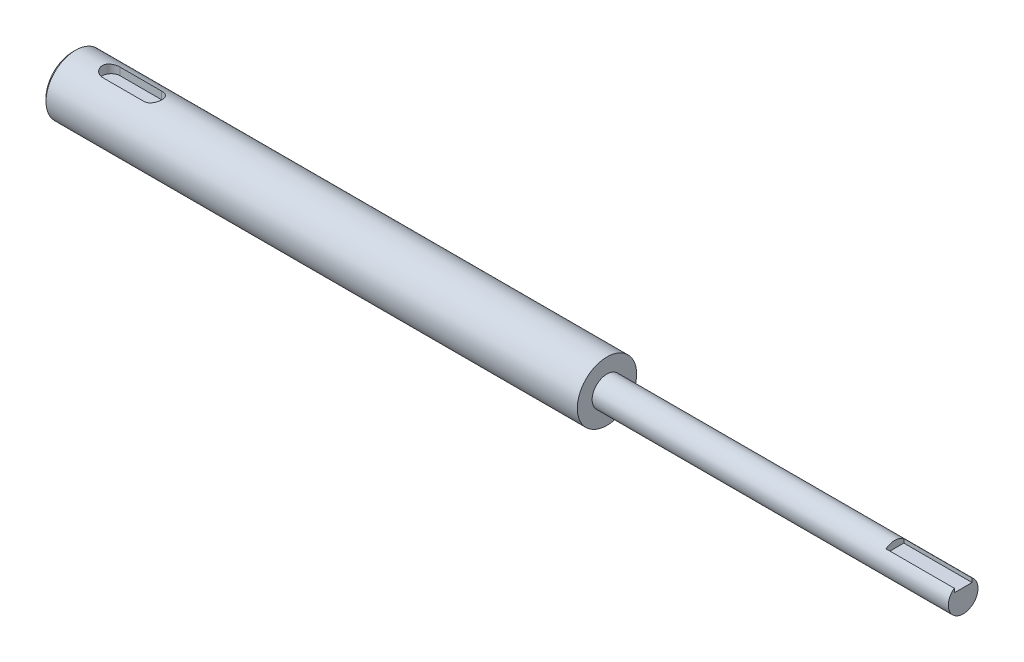
ISO-10303-21;
HEADER;
FILE_DESCRIPTION(('STEP AP214'),'2;1');
FILE_NAME('part.step','',(''),(''),'','','');
FILE_SCHEMA(('AUTOMOTIVE_DESIGN { 1 0 10303 214 1 1 1 1 }'));
ENDSEC;
DATA;
#1=APPLICATION_CONTEXT('core data for automotive mechanical design processes');
#2=APPLICATION_PROTOCOL_DEFINITION('international standard','automotive_design',2000,#1);
#3=PRODUCT_CONTEXT('',#1,'mechanical');
#4=PRODUCT('Part','Part','',(#3));
#5=PRODUCT_RELATED_PRODUCT_CATEGORY('part','',(#4));
#6=PRODUCT_DEFINITION_FORMATION('','',#4);
#7=PRODUCT_DEFINITION_CONTEXT('part definition',#1,'design');
#8=PRODUCT_DEFINITION('design','',#6,#7);
#9=PRODUCT_DEFINITION_SHAPE('','',#8);
#10=(LENGTH_UNIT() NAMED_UNIT(*) SI_UNIT(.MILLI.,.METRE.));
#11=(NAMED_UNIT(*) PLANE_ANGLE_UNIT() SI_UNIT($,.RADIAN.));
#12=(NAMED_UNIT(*) SI_UNIT($,.STERADIAN.) SOLID_ANGLE_UNIT());
#13=UNCERTAINTY_MEASURE_WITH_UNIT(LENGTH_MEASURE(1.E-05),#10,'distance_accuracy_value','');
#14=(GEOMETRIC_REPRESENTATION_CONTEXT(3) GLOBAL_UNCERTAINTY_ASSIGNED_CONTEXT((#13)) GLOBAL_UNIT_ASSIGNED_CONTEXT((#10,
#11,#12)) REPRESENTATION_CONTEXT('',''));
#15=CARTESIAN_POINT('',(0.,0.,0.));
#16=DIRECTION('',(0.,0.,1.));
#17=DIRECTION('',(1.,0.,0.));
#18=AXIS2_PLACEMENT_3D('',#15,#16,#17);
#19=CARTESIAN_POINT('',(150.,0.,0.));
#20=DIRECTION('',(-1.,0.,0.));
#21=DIRECTION('',(0.,0.,1.));
#22=AXIS2_PLACEMENT_3D('',#19,#20,#21);
#23=CYLINDRICAL_SURFACE('',#22,10.);
#24=DIRECTION('',(-1.,0.,0.));
#25=VECTOR('',#24,1.);
#26=CARTESIAN_POINT('',(150.,9.53939201416946,-3.));
#27=LINE('',#26,#25);
#28=CARTESIAN_POINT('',(13.,9.53939201416946,-3.));
#29=VERTEX_POINT('',#28);
#30=CARTESIAN_POINT('',(27.,9.53939201416946,-3.));
#31=VERTEX_POINT('',#30);
#32=EDGE_CURVE('E221',#29,#31,#27,.F.);
#33=ORIENTED_EDGE('',*,*,#32,.T.);
#34=CARTESIAN_POINT('',(27.,9.53939201416946,-3.));
#35=CARTESIAN_POINT('',(27.0823355208227,9.53938054248207,-3.00001027845728));
#36=CARTESIAN_POINT('',(27.1646644550632,9.54045772064378,-2.99661062684472));
#37=CARTESIAN_POINT('',(27.3286939527655,9.54470412105986,-2.98307142899347));
#38=CARTESIAN_POINT('',(27.4103946533244,9.54787287296848,-2.97293339805418));
#39=CARTESIAN_POINT('',(27.5723849156732,9.55620668351003,-2.94603140625045));
#40=CARTESIAN_POINT('',(27.652677524043,9.56136667250114,-2.92928426957737));
#41=CARTESIAN_POINT('',(27.8114758441342,9.57351626651178,-2.88932853030395));
#42=CARTESIAN_POINT('',(27.8899815090674,9.58050591937828,-2.86611975872641));
#43=CARTESIAN_POINT('',(28.1219493879901,9.60391637654137,-2.78708584446024));
#44=CARTESIAN_POINT('',(28.272068438833,9.62279007830391,-2.72181852542972));
#45=CARTESIAN_POINT('',(28.559226043979,9.66493213967819,-2.56815043531276));
#46=CARTESIAN_POINT('',(28.6962584707622,9.6882025429064,-2.4797388992416));
#47=CARTESIAN_POINT('',(28.9577229879478,9.73733650515374,-2.27929879634443));
#48=CARTESIAN_POINT('',(29.0816848740609,9.76325505469874,-2.16666914746584));
#49=CARTESIAN_POINT('',(29.3092736148388,9.81429628475077,-1.92227736150433));
#50=CARTESIAN_POINT('',(29.412897033861,9.8394188301941,-1.79051199848164));
#51=CARTESIAN_POINT('',(29.5989268650946,9.88666477976534,-1.50821997465697));
#52=CARTESIAN_POINT('',(29.6808501797826,9.90871541546877,-1.35736167401016));
#53=CARTESIAN_POINT('',(29.8179770040029,9.94668940088144,-1.04324233568303));
#54=CARTESIAN_POINT('',(29.873187403368,9.96261433032403,-0.879984508687986));
#55=CARTESIAN_POINT('',(29.953759551791,9.98615279768398,-0.550649404820603));
#56=CARTESIAN_POINT('',(29.9799297035176,9.99399098526792,-0.384786253016205));
#57=CARTESIAN_POINT('',(30.004234695146,10.0012640407204,-0.0508471415689293));
#58=CARTESIAN_POINT('',(30.0023748426782,10.0007004995012,0.117228393125337));
#59=CARTESIAN_POINT('',(29.9712141793086,9.99139205125586,0.445143199271823));
#60=CARTESIAN_POINT('',(29.9427893091919,9.98290831016512,0.605074290763026));
#61=CARTESIAN_POINT('',(29.8607367303745,9.95903027401822,0.917780104370312));
#62=CARTESIAN_POINT('',(29.8071077013173,9.94363561692558,1.07055445110879));
#63=CARTESIAN_POINT('',(29.6755755564753,9.90730429851782,1.36669563173911));
#64=CARTESIAN_POINT('',(29.5973967112239,9.88630511384915,1.50993201207612));
#65=CARTESIAN_POINT('',(29.4192028199656,9.84099249303647,1.781531059161));
#66=CARTESIAN_POINT('',(29.3191828810593,9.81667831471806,1.9098903832325));
#67=CARTESIAN_POINT('',(29.0956160238154,9.7662334714278,2.15330901082205));
#68=CARTESIAN_POINT('',(28.9713122724738,9.74006890899097,2.26766702955975));
#69=CARTESIAN_POINT('',(28.7050051531489,9.68968430229327,2.47413538985067));
#70=CARTESIAN_POINT('',(28.5629966392702,9.66546482675134,2.5662392402618));
#71=CARTESIAN_POINT('',(28.2634381431001,9.62154457591303,2.72632814481701));
#72=CARTESIAN_POINT('',(28.1057456408129,9.60189192491895,2.79406012682262));
#73=CARTESIAN_POINT('',(27.7805509920369,9.56991327306402,2.90171772009404));
#74=CARTESIAN_POINT('',(27.6130642785713,9.55757606951749,2.94168586436072));
#75=CARTESIAN_POINT('',(27.3700102218596,9.54628064650012,2.97802407180159));
#76=CARTESIAN_POINT('',(27.2962185316408,9.54370312550533,2.98626405978017));
#77=CARTESIAN_POINT('',(27.148297041801,9.54025857223564,2.99724711229708));
#78=CARTESIAN_POINT('',(27.0741679006723,9.53938902493288,2.99999825936538));
#79=CARTESIAN_POINT('',(27.,9.53939201416946,3.));
#80=B_SPLINE_CURVE_WITH_KNOTS('',3,(#34,#35,#36,#37,#38,#39,#40,#41,#42,#43,#44,#45,#46,#47,#48,
#49,#50,#51,#52,#53,#54,#55,#56,#57,#58,#59,#60,#61,#62,#63,#64,#65,#66,#67,#68,#69,#70,#71,#72,
#73,#74,#75,#76,#77,#78,#79),.UNSPECIFIED.,.F.,.F.,(4,2,2,2,2,2,2,2,2,2,2,2,2,2,2,2,2,2,2,2,2,2,
4),(0.,0.246918142439467,0.493780777706087,0.740019009623012,0.986263681482023,1.47813347402025,
1.97023245590779,2.47635119822766,2.98255536239033,3.4992281062007,4.01576751791672,
4.51753600864764,5.019209488041,5.50490358251092,5.99062312360831,6.48200583350621,
6.97349873739169,7.48389234847121,7.99443465298714,8.51013494368214,9.02504345105574,
9.24774267716777,9.47011372732391),.UNSPECIFIED.);
#81=CARTESIAN_POINT('',(27.,9.53939201416946,3.));
#82=VERTEX_POINT('',#81);
#83=EDGE_CURVE('E169',#31,#82,#80,.T.);
#84=ORIENTED_EDGE('',*,*,#83,.T.);
#85=DIRECTION('',(-1.,0.,0.));
#86=VECTOR('',#85,1.);
#87=CARTESIAN_POINT('',(150.,9.53939201416946,3.));
#88=LINE('',#87,#86);
#89=CARTESIAN_POINT('',(13.,9.53939201416946,3.));
#90=VERTEX_POINT('',#89);
#91=EDGE_CURVE('E225',#82,#90,#88,.T.);
#92=ORIENTED_EDGE('',*,*,#91,.T.);
#93=CARTESIAN_POINT('',(13.,9.53939201416946,3.));
#94=CARTESIAN_POINT('',(12.9176644791773,9.53938054248207,3.00001027845728));
#95=CARTESIAN_POINT('',(12.8353355449368,9.54045772064378,2.99661062684472));
#96=CARTESIAN_POINT('',(12.6713060472345,9.54470412105986,2.98307142899347));
#97=CARTESIAN_POINT('',(12.5896053466756,9.54787287296848,2.97293339805418));
#98=CARTESIAN_POINT('',(12.4276150843268,9.55620668351003,2.94603140625045));
#99=CARTESIAN_POINT('',(12.347322475957,9.56136667250114,2.92928426957737));
#100=CARTESIAN_POINT('',(12.1885241558658,9.57351626651178,2.88932853030395));
#101=CARTESIAN_POINT('',(12.1100184909326,9.58050591937828,2.86611975872641));
#102=CARTESIAN_POINT('',(11.8780506120099,9.60391637654137,2.78708584446024));
#103=CARTESIAN_POINT('',(11.727931561167,9.62279007830391,2.72181852542972));
#104=CARTESIAN_POINT('',(11.440773956021,9.66493213967819,2.56815043531276));
#105=CARTESIAN_POINT('',(11.3037415292378,9.6882025429064,2.4797388992416));
#106=CARTESIAN_POINT('',(11.0422770120522,9.73733650515374,2.27929879634442));
#107=CARTESIAN_POINT('',(10.9183151259391,9.76325505469874,2.16666914746584));
#108=CARTESIAN_POINT('',(10.6907263851612,9.81429628475077,1.92227736150433));
#109=CARTESIAN_POINT('',(10.587102966139,9.8394188301941,1.79051199848164));
#110=CARTESIAN_POINT('',(10.4010731349054,9.88666477976534,1.50821997465697));
#111=CARTESIAN_POINT('',(10.3191498202174,9.90871541546877,1.35736167401016));
#112=CARTESIAN_POINT('',(10.1820229959971,9.94668940088144,1.04324233568303));
#113=CARTESIAN_POINT('',(10.126812596632,9.96261433032403,0.879984508687984));
#114=CARTESIAN_POINT('',(10.046240448209,9.98615279768398,0.550649404820601));
#115=CARTESIAN_POINT('',(10.0200702964824,9.99399098526792,0.384786253016202));
#116=CARTESIAN_POINT('',(9.99576530485396,10.0012640407204,0.0508471415689264));
#117=CARTESIAN_POINT('',(9.99762515732182,10.0007004995012,-0.117228393125341));
#118=CARTESIAN_POINT('',(10.0287858206914,9.99139205125586,-0.445143199271826));
#119=CARTESIAN_POINT('',(10.0572106908081,9.98290831016512,-0.605074290763029));
#120=CARTESIAN_POINT('',(10.1392632696255,9.95903027401822,-0.917780104370315));
#121=CARTESIAN_POINT('',(10.1928922986827,9.94363561692558,-1.07055445110879));
#122=CARTESIAN_POINT('',(10.3244244435248,9.90730429851782,-1.36669563173912));
#123=CARTESIAN_POINT('',(10.4026032887761,9.88630511384915,-1.50993201207613));
#124=CARTESIAN_POINT('',(10.5807971800344,9.84099249303646,-1.781531059161));
#125=CARTESIAN_POINT('',(10.6808171189407,9.81667831471806,-1.90989038323251));
#126=CARTESIAN_POINT('',(10.9043839761846,9.7662334714278,-2.15330901082206));
#127=CARTESIAN_POINT('',(11.0286877275262,9.74006890899097,-2.26766702955975));
#128=CARTESIAN_POINT('',(11.2949948468511,9.68968430229327,-2.47413538985067));
#129=CARTESIAN_POINT('',(11.4370033607298,9.66546482675134,-2.5662392402618));
#130=CARTESIAN_POINT('',(11.7365618568999,9.62154457591303,-2.72632814481701));
#131=CARTESIAN_POINT('',(11.8942543591871,9.60189192491895,-2.79406012682263));
#132=CARTESIAN_POINT('',(12.2194490079631,9.56991327306402,-2.90171772009404));
#133=CARTESIAN_POINT('',(12.3869357214287,9.55757606951749,-2.94168586436072));
#134=CARTESIAN_POINT('',(12.6299897781404,9.54628064650011,-2.97802407180159));
#135=CARTESIAN_POINT('',(12.7037814683592,9.54370312550533,-2.98626405978017));
#136=CARTESIAN_POINT('',(12.851702958199,9.54025857223564,-2.99724711229708));
#137=CARTESIAN_POINT('',(12.9258320993277,9.53938902493288,-2.99999825936538));
#138=CARTESIAN_POINT('',(13.,9.53939201416946,-3.));
#139=B_SPLINE_CURVE_WITH_KNOTS('',3,(#93,#94,#95,#96,#97,#98,#99,#100,#101,#102,#103,#104,#105,
#106,#107,#108,#109,#110,#111,#112,#113,#114,#115,#116,#117,#118,#119,#120,#121,#122,#123,#124,
#125,#126,#127,#128,#129,#130,#131,#132,#133,#134,#135,#136,#137,#138),.UNSPECIFIED.,.F.,.F.,(4,
2,2,2,2,2,2,2,2,2,2,2,2,2,2,2,2,2,2,2,2,2,4),(0.,0.246918142439467,0.493780777706085,
0.740019009623011,0.986263681482025,1.47813347402025,1.97023245590779,2.47635119822767,
2.98255536239033,3.49922810620071,4.01576751791672,4.51753600864764,5.01920948804101,
5.50490358251093,5.99062312360832,6.48200583350621,6.9734987373917,7.48389234847122,
7.99443465298715,8.51013494368214,9.02504345105574,9.24774267716778,9.47011372732391),.UNSPECIFIED.);
#140=EDGE_CURVE('E73',#90,#29,#139,.T.);
#141=ORIENTED_EDGE('',*,*,#140,.T.);
#142=EDGE_LOOP('',(#33,#84,#92,#141));
#143=FACE_BOUND('',#142,.T.);
#144=CARTESIAN_POINT('',(1.,0.,0.));
#145=DIRECTION('',(1.,0.,0.));
#146=DIRECTION('',(0.,0.,-1.));
#147=AXIS2_PLACEMENT_3D('',#144,#145,#146);
#148=CIRCLE('',#147,10.);
#149=CARTESIAN_POINT('',(1.,0.,-10.));
#150=VERTEX_POINT('',#149);
#151=EDGE_CURVE('E218',#150,#150,#148,.T.);
#152=ORIENTED_EDGE('',*,*,#151,.T.);
#153=EDGE_LOOP('',(#152));
#154=FACE_BOUND('',#153,.T.);
#155=CARTESIAN_POINT('',(180.,0.,0.));
#156=DIRECTION('',(1.,0.,0.));
#157=DIRECTION('',(0.,0.,-1.));
#158=AXIS2_PLACEMENT_3D('',#155,#156,#157);
#159=CIRCLE('',#158,10.);
#160=CARTESIAN_POINT('',(180.,0.,-10.));
#161=VERTEX_POINT('',#160);
#162=EDGE_CURVE('E149',#161,#161,#159,.T.);
#163=ORIENTED_EDGE('',*,*,#162,.F.);
#164=EDGE_LOOP('',(#163));
#165=FACE_BOUND('',#164,.T.);
#166=ADVANCED_FACE('F49',(#143,#154,#165),#23,.T.);
#167=CARTESIAN_POINT('',(0.,0.,0.));
#168=DIRECTION('',(1.,0.,0.));
#169=DIRECTION('',(0.,0.,-1.));
#170=AXIS2_PLACEMENT_3D('',#167,#168,#169);
#171=PLANE('',#170);
#172=CARTESIAN_POINT('',(0.,0.,0.));
#173=DIRECTION('',(1.,0.,0.));
#174=DIRECTION('',(0.,0.,-1.));
#175=AXIS2_PLACEMENT_3D('',#172,#173,#174);
#176=CIRCLE('',#175,9.00000000000001);
#177=CARTESIAN_POINT('',(0.,0.,-9.00000000000001));
#178=VERTEX_POINT('',#177);
#179=EDGE_CURVE('E216',#178,#178,#176,.F.);
#180=ORIENTED_EDGE('',*,*,#179,.T.);
#181=EDGE_LOOP('',(#180));
#182=FACE_BOUND('',#181,.T.);
#183=ADVANCED_FACE('F207',(#182),#171,.F.);
#184=CARTESIAN_POINT('',(13.,7.,0.));
#185=DIRECTION('',(0.,1.,0.));
#186=DIRECTION('',(0.,0.,1.));
#187=AXIS2_PLACEMENT_3D('',#184,#185,#186);
#188=CYLINDRICAL_SURFACE('',#187,3.);
#189=DIRECTION('',(0.,1.,0.));
#190=VECTOR('',#189,1.);
#191=CARTESIAN_POINT('',(13.,7.,3.));
#192=LINE('',#191,#190);
#193=CARTESIAN_POINT('',(13.,7.,3.));
#194=VERTEX_POINT('',#193);
#195=EDGE_CURVE('E166',#194,#90,#192,.T.);
#196=ORIENTED_EDGE('',*,*,#195,.F.);
#197=CARTESIAN_POINT('',(13.,7.,0.));
#198=DIRECTION('',(0.,1.,0.));
#199=DIRECTION('',(0.,0.,1.));
#200=AXIS2_PLACEMENT_3D('',#197,#198,#199);
#201=CIRCLE('',#200,3.);
#202=CARTESIAN_POINT('',(13.,7.,-3.));
#203=VERTEX_POINT('',#202);
#204=EDGE_CURVE('E154',#203,#194,#201,.T.);
#205=ORIENTED_EDGE('',*,*,#204,.F.);
#206=DIRECTION('',(0.,1.,0.));
#207=VECTOR('',#206,1.);
#208=CARTESIAN_POINT('',(13.,7.,-3.));
#209=LINE('',#208,#207);
#210=EDGE_CURVE('E167',#203,#29,#209,.T.);
#211=ORIENTED_EDGE('',*,*,#210,.T.);
#212=ORIENTED_EDGE('',*,*,#140,.F.);
#213=EDGE_LOOP('',(#196,#205,#211,#212));
#214=FACE_BOUND('',#213,.T.);
#215=ADVANCED_FACE('F204',(#214),#188,.F.);
#216=CARTESIAN_POINT('',(13.,7.,-3.));
#217=DIRECTION('',(0.,0.,-1.));
#218=DIRECTION('',(-1.,0.,0.));
#219=AXIS2_PLACEMENT_3D('',#216,#217,#218);
#220=PLANE('',#219);
#221=ORIENTED_EDGE('',*,*,#210,.F.);
#222=DIRECTION('',(-1.,0.,0.));
#223=VECTOR('',#222,1.);
#224=CARTESIAN_POINT('',(13.,7.,-3.));
#225=LINE('',#224,#223);
#226=CARTESIAN_POINT('',(27.,7.,-3.));
#227=VERTEX_POINT('',#226);
#228=EDGE_CURVE('E163',#227,#203,#225,.T.);
#229=ORIENTED_EDGE('',*,*,#228,.F.);
#230=DIRECTION('',(0.,1.,0.));
#231=VECTOR('',#230,1.);
#232=CARTESIAN_POINT('',(27.,7.,-3.));
#233=LINE('',#232,#231);
#234=EDGE_CURVE('E170',#227,#31,#233,.T.);
#235=ORIENTED_EDGE('',*,*,#234,.T.);
#236=ORIENTED_EDGE('',*,*,#32,.F.);
#237=EDGE_LOOP('',(#221,#229,#235,#236));
#238=FACE_BOUND('',#237,.T.);
#239=ADVANCED_FACE('F198',(#238),#220,.F.);
#240=CARTESIAN_POINT('',(27.,7.,0.));
#241=DIRECTION('',(0.,1.,0.));
#242=DIRECTION('',(0.,0.,1.));
#243=AXIS2_PLACEMENT_3D('',#240,#241,#242);
#244=CYLINDRICAL_SURFACE('',#243,3.);
#245=ORIENTED_EDGE('',*,*,#234,.F.);
#246=CARTESIAN_POINT('',(27.,7.,0.));
#247=DIRECTION('',(0.,1.,0.));
#248=DIRECTION('',(0.,0.,-1.));
#249=AXIS2_PLACEMENT_3D('',#246,#247,#248);
#250=CIRCLE('',#249,3.);
#251=CARTESIAN_POINT('',(27.,7.,3.));
#252=VERTEX_POINT('',#251);
#253=EDGE_CURVE('E160',#252,#227,#250,.T.);
#254=ORIENTED_EDGE('',*,*,#253,.F.);
#255=DIRECTION('',(0.,1.,0.));
#256=VECTOR('',#255,1.);
#257=CARTESIAN_POINT('',(27.,7.,3.));
#258=LINE('',#257,#256);
#259=EDGE_CURVE('E173',#252,#82,#258,.T.);
#260=ORIENTED_EDGE('',*,*,#259,.T.);
#261=ORIENTED_EDGE('',*,*,#83,.F.);
#262=EDGE_LOOP('',(#245,#254,#260,#261));
#263=FACE_BOUND('',#262,.T.);
#264=ADVANCED_FACE('F192',(#263),#244,.F.);
#265=CARTESIAN_POINT('',(13.,7.,3.));
#266=DIRECTION('',(0.,0.,1.));
#267=DIRECTION('',(1.,0.,0.));
#268=AXIS2_PLACEMENT_3D('',#265,#266,#267);
#269=PLANE('',#268);
#270=ORIENTED_EDGE('',*,*,#259,.F.);
#271=DIRECTION('',(1.,0.,0.));
#272=VECTOR('',#271,1.);
#273=CARTESIAN_POINT('',(13.,7.,3.));
#274=LINE('',#273,#272);
#275=EDGE_CURVE('E157',#194,#252,#274,.T.);
#276=ORIENTED_EDGE('',*,*,#275,.F.);
#277=ORIENTED_EDGE('',*,*,#195,.T.);
#278=ORIENTED_EDGE('',*,*,#91,.F.);
#279=EDGE_LOOP('',(#270,#276,#277,#278));
#280=FACE_BOUND('',#279,.T.);
#281=ADVANCED_FACE('F197',(#280),#269,.F.);
#282=CARTESIAN_POINT('',(13.,7.,0.));
#283=DIRECTION('',(0.,1.,0.));
#284=DIRECTION('',(0.,0.,1.));
#285=AXIS2_PLACEMENT_3D('',#282,#283,#284);
#286=PLANE('',#285);
#287=ORIENTED_EDGE('',*,*,#204,.T.);
#288=ORIENTED_EDGE('',*,*,#275,.T.);
#289=ORIENTED_EDGE('',*,*,#253,.T.);
#290=ORIENTED_EDGE('',*,*,#228,.T.);
#291=EDGE_LOOP('',(#287,#288,#289,#290));
#292=FACE_BOUND('',#291,.T.);
#293=ADVANCED_FACE('F202',(#292),#286,.T.);
#294=CARTESIAN_POINT('',(1.,0.,0.));
#295=DIRECTION('',(1.,0.,0.));
#296=DIRECTION('',(0.,0.,-1.));
#297=AXIS2_PLACEMENT_3D('',#294,#295,#296);
#298=CONICAL_SURFACE('',#297,10.,0.785398163397444);
#299=ORIENTED_EDGE('',*,*,#179,.F.);
#300=EDGE_LOOP('',(#299));
#301=FACE_BOUND('',#300,.T.);
#302=ORIENTED_EDGE('',*,*,#151,.F.);
#303=EDGE_LOOP('',(#302));
#304=FACE_BOUND('',#303,.T.);
#305=ADVANCED_FACE('F52',(#301,#304),#298,.T.);
#306=CARTESIAN_POINT('',(180.,0.,0.));
#307=DIRECTION('',(1.,0.,0.));
#308=DIRECTION('',(0.,0.,-1.));
#309=AXIS2_PLACEMENT_3D('',#306,#307,#308);
#310=PLANE('',#309);
#311=CARTESIAN_POINT('',(180.,0.,0.));
#312=DIRECTION('',(1.,0.,0.));
#313=DIRECTION('',(0.,0.,-1.));
#314=AXIS2_PLACEMENT_3D('',#311,#312,#313);
#315=CIRCLE('',#314,5.);
#316=CARTESIAN_POINT('',(180.,0.,-5.));
#317=VERTEX_POINT('',#316);
#318=EDGE_CURVE('E146',#317,#317,#315,.T.);
#319=ORIENTED_EDGE('',*,*,#318,.F.);
#320=EDGE_LOOP('',(#319));
#321=FACE_BOUND('',#320,.T.);
#322=ORIENTED_EDGE('',*,*,#162,.T.);
#323=EDGE_LOOP('',(#322));
#324=FACE_BOUND('',#323,.T.);
#325=ADVANCED_FACE('F238',(#321,#324),#310,.T.);
#326=CARTESIAN_POINT('',(180.,0.,0.));
#327=DIRECTION('',(1.,0.,0.));
#328=DIRECTION('',(0.,0.,-1.));
#329=AXIS2_PLACEMENT_3D('',#326,#327,#328);
#330=CYLINDRICAL_SURFACE('',#329,5.);
#331=DIRECTION('',(1.,0.,0.));
#332=VECTOR('',#331,1.);
#333=CARTESIAN_POINT('',(180.,4.,3.));
#334=LINE('',#333,#332);
#335=CARTESIAN_POINT('',(277.,4.,3.));
#336=VERTEX_POINT('',#335);
#337=CARTESIAN_POINT('',(300.,4.,3.));
#338=VERTEX_POINT('',#337);
#339=EDGE_CURVE('E143',#336,#338,#334,.T.);
#340=ORIENTED_EDGE('',*,*,#339,.F.);
#341=CARTESIAN_POINT('',(277.,0.,0.));
#342=DIRECTION('',(1.,0.,0.));
#343=DIRECTION('',(0.,0.,-1.));
#344=AXIS2_PLACEMENT_3D('',#341,#342,#343);
#345=CIRCLE('',#344,5.);
#346=CARTESIAN_POINT('',(277.,4.,-3.));
#347=VERTEX_POINT('',#346);
#348=EDGE_CURVE('E11',#336,#347,#345,.F.);
#349=ORIENTED_EDGE('',*,*,#348,.T.);
#350=DIRECTION('',(1.,0.,0.));
#351=VECTOR('',#350,1.);
#352=CARTESIAN_POINT('',(180.,4.,-3.));
#353=LINE('',#352,#351);
#354=CARTESIAN_POINT('',(300.,4.,-3.));
#355=VERTEX_POINT('',#354);
#356=EDGE_CURVE('E140',#355,#347,#353,.F.);
#357=ORIENTED_EDGE('',*,*,#356,.F.);
#358=CARTESIAN_POINT('',(300.,0.,0.));
#359=DIRECTION('',(1.,0.,0.));
#360=DIRECTION('',(0.,0.,-1.));
#361=AXIS2_PLACEMENT_3D('',#358,#359,#360);
#362=CIRCLE('',#361,5.);
#363=EDGE_CURVE('E145',#338,#355,#362,.T.);
#364=ORIENTED_EDGE('',*,*,#363,.F.);
#365=EDGE_LOOP('',(#340,#349,#357,#364));
#366=FACE_BOUND('',#365,.T.);
#367=ORIENTED_EDGE('',*,*,#318,.T.);
#368=EDGE_LOOP('',(#367));
#369=FACE_BOUND('',#368,.T.);
#370=ADVANCED_FACE('F243',(#366,#369),#330,.T.);
#371=CARTESIAN_POINT('',(300.,0.,0.));
#372=DIRECTION('',(1.,0.,0.));
#373=DIRECTION('',(0.,0.,-1.));
#374=AXIS2_PLACEMENT_3D('',#371,#372,#373);
#375=PLANE('',#374);
#376=DIRECTION('',(0.,-1.,0.));
#377=VECTOR('',#376,1.);
#378=CARTESIAN_POINT('',(300.,0.,3.));
#379=LINE('',#378,#377);
#380=CARTESIAN_POINT('',(300.,2.67044503784244,3.));
#381=VERTEX_POINT('',#380);
#382=EDGE_CURVE('E58',#338,#381,#379,.T.);
#383=ORIENTED_EDGE('',*,*,#382,.F.);
#384=ORIENTED_EDGE('',*,*,#363,.T.);
#385=DIRECTION('',(0.,1.,0.));
#386=VECTOR('',#385,1.);
#387=CARTESIAN_POINT('',(300.,2.67044503784244,-3.));
#388=LINE('',#387,#386);
#389=CARTESIAN_POINT('',(300.,2.67044503784244,-3.));
#390=VERTEX_POINT('',#389);
#391=EDGE_CURVE('E124',#390,#355,#388,.T.);
#392=ORIENTED_EDGE('',*,*,#391,.F.);
#393=DIRECTION('',(0.,0.,-1.));
#394=VECTOR('',#393,1.);
#395=CARTESIAN_POINT('',(300.,2.67044503784244,3.));
#396=LINE('',#395,#394);
#397=EDGE_CURVE('E137',#381,#390,#396,.T.);
#398=ORIENTED_EDGE('',*,*,#397,.F.);
#399=EDGE_LOOP('',(#383,#384,#392,#398));
#400=FACE_BOUND('',#399,.T.);
#401=ADVANCED_FACE('F240',(#400),#375,.T.);
#402=CARTESIAN_POINT('',(277.,2.67044503784244,3.));
#403=DIRECTION('',(0.,0.,1.));
#404=DIRECTION('',(1.,0.,0.));
#405=AXIS2_PLACEMENT_3D('',#402,#403,#404);
#406=PLANE('',#405);
#407=ORIENTED_EDGE('',*,*,#339,.T.);
#408=ORIENTED_EDGE('',*,*,#382,.T.);
#409=DIRECTION('',(1.,0.,0.));
#410=VECTOR('',#409,1.);
#411=CARTESIAN_POINT('',(277.,2.67044503784244,3.));
#412=LINE('',#411,#410);
#413=CARTESIAN_POINT('',(277.,2.67044503784244,3.));
#414=VERTEX_POINT('',#413);
#415=EDGE_CURVE('E65',#414,#381,#412,.T.);
#416=ORIENTED_EDGE('',*,*,#415,.F.);
#417=DIRECTION('',(0.,-1.,0.));
#418=VECTOR('',#417,1.);
#419=CARTESIAN_POINT('',(277.,2.67044503784244,3.));
#420=LINE('',#419,#418);
#421=EDGE_CURVE('E118',#336,#414,#420,.T.);
#422=ORIENTED_EDGE('',*,*,#421,.F.);
#423=EDGE_LOOP('',(#407,#408,#416,#422));
#424=FACE_BOUND('',#423,.T.);
#425=ADVANCED_FACE('F126',(#424),#406,.F.);
#426=CARTESIAN_POINT('',(277.,2.67044503784244,-3.));
#427=DIRECTION('',(0.,0.,-1.));
#428=DIRECTION('',(-1.,0.,0.));
#429=AXIS2_PLACEMENT_3D('',#426,#427,#428);
#430=PLANE('',#429);
#431=ORIENTED_EDGE('',*,*,#356,.T.);
#432=DIRECTION('',(0.,1.,0.));
#433=VECTOR('',#432,1.);
#434=CARTESIAN_POINT('',(277.,2.67044503784244,-3.));
#435=LINE('',#434,#433);
#436=CARTESIAN_POINT('',(277.,2.67044503784244,-3.));
#437=VERTEX_POINT('',#436);
#438=EDGE_CURVE('E130',#437,#347,#435,.T.);
#439=ORIENTED_EDGE('',*,*,#438,.F.);
#440=DIRECTION('',(1.,0.,0.));
#441=VECTOR('',#440,1.);
#442=CARTESIAN_POINT('',(277.,2.67044503784244,-3.));
#443=LINE('',#442,#441);
#444=EDGE_CURVE('E129',#437,#390,#443,.T.);
#445=ORIENTED_EDGE('',*,*,#444,.T.);
#446=ORIENTED_EDGE('',*,*,#391,.T.);
#447=EDGE_LOOP('',(#431,#439,#445,#446));
#448=FACE_BOUND('',#447,.T.);
#449=ADVANCED_FACE('F253',(#448),#430,.F.);
#450=CARTESIAN_POINT('',(277.,2.67044503784244,3.));
#451=DIRECTION('',(0.,-1.,0.));
#452=DIRECTION('',(0.,0.,-1.));
#453=AXIS2_PLACEMENT_3D('',#450,#451,#452);
#454=PLANE('',#453);
#455=ORIENTED_EDGE('',*,*,#397,.T.);
#456=ORIENTED_EDGE('',*,*,#444,.F.);
#457=DIRECTION('',(0.,0.,-1.));
#458=VECTOR('',#457,1.);
#459=CARTESIAN_POINT('',(277.,2.67044503784244,3.));
#460=LINE('',#459,#458);
#461=EDGE_CURVE('E121',#414,#437,#460,.T.);
#462=ORIENTED_EDGE('',*,*,#461,.F.);
#463=ORIENTED_EDGE('',*,*,#415,.T.);
#464=EDGE_LOOP('',(#455,#456,#462,#463));
#465=FACE_BOUND('',#464,.T.);
#466=ADVANCED_FACE('F132',(#465),#454,.F.);
#467=CARTESIAN_POINT('',(277.,0.,0.));
#468=DIRECTION('',(1.,0.,0.));
#469=DIRECTION('',(0.,0.,-1.));
#470=AXIS2_PLACEMENT_3D('',#467,#468,#469);
#471=PLANE('',#470);
#472=ORIENTED_EDGE('',*,*,#421,.T.);
#473=ORIENTED_EDGE('',*,*,#461,.T.);
#474=ORIENTED_EDGE('',*,*,#438,.T.);
#475=ORIENTED_EDGE('',*,*,#348,.F.);
#476=EDGE_LOOP('',(#472,#473,#474,#475));
#477=FACE_BOUND('',#476,.T.);
#478=ADVANCED_FACE('F119',(#477),#471,.T.);
#479=CLOSED_SHELL('',(#166,#183,#215,#239,#264,#281,#293,#305,#325,#370,#401,#425,#449,#466,#478));
#480=MANIFOLD_SOLID_BREP('B2',#479);
#481=ADVANCED_BREP_SHAPE_REPRESENTATION('',(#18,#480),#14);
#482=SHAPE_DEFINITION_REPRESENTATION(#9,#481);
ENDSEC;
END-ISO-10303-21;
